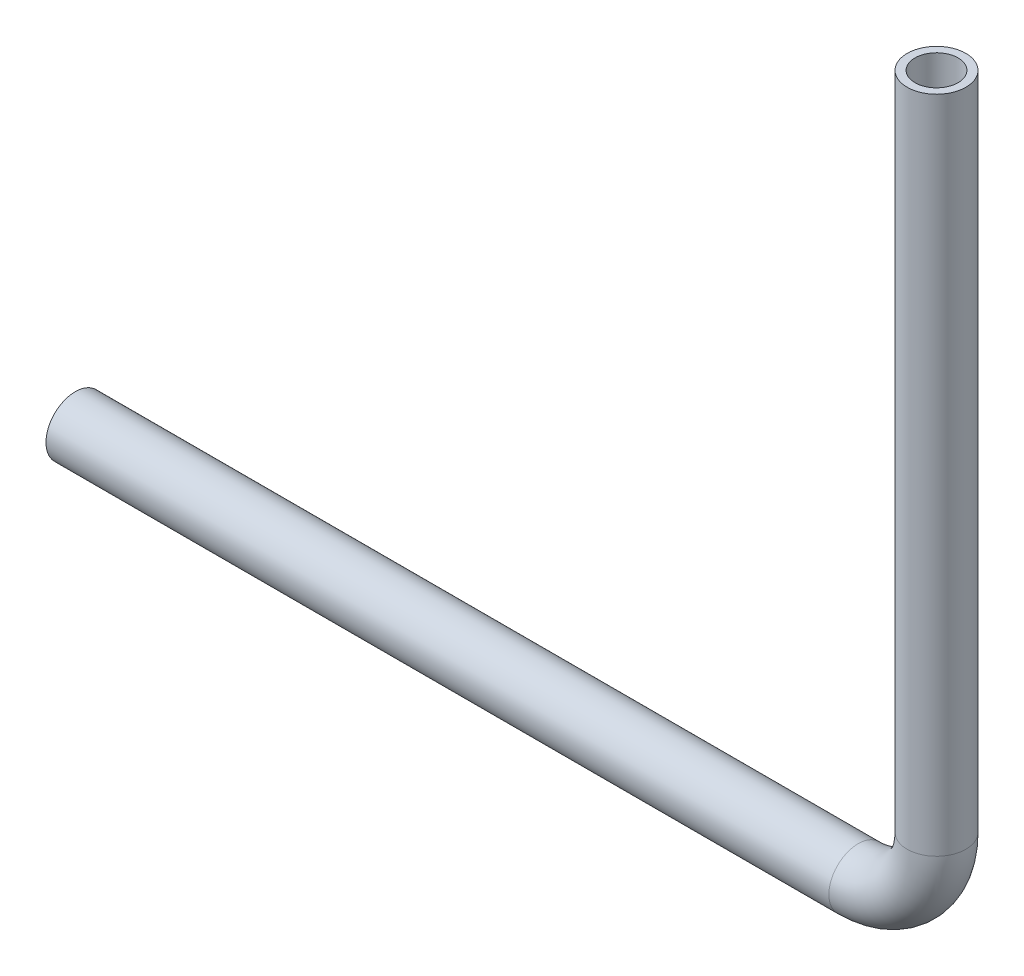
ISO-10303-21;
HEADER;
FILE_DESCRIPTION(('STEP AP214'),'2;1');
FILE_NAME('part.step','',(''),(''),'','','');
FILE_SCHEMA(('AUTOMOTIVE_DESIGN { 1 0 10303 214 1 1 1 1 }'));
ENDSEC;
DATA;
#1=APPLICATION_CONTEXT('core data for automotive mechanical design processes');
#2=APPLICATION_PROTOCOL_DEFINITION('international standard','automotive_design',2000,#1);
#3=PRODUCT_CONTEXT('',#1,'mechanical');
#4=PRODUCT('Part','Part','',(#3));
#5=PRODUCT_RELATED_PRODUCT_CATEGORY('part','',(#4));
#6=PRODUCT_DEFINITION_FORMATION('','',#4);
#7=PRODUCT_DEFINITION_CONTEXT('part definition',#1,'design');
#8=PRODUCT_DEFINITION('design','',#6,#7);
#9=PRODUCT_DEFINITION_SHAPE('','',#8);
#10=(LENGTH_UNIT() NAMED_UNIT(*) SI_UNIT(.MILLI.,.METRE.));
#11=(NAMED_UNIT(*) PLANE_ANGLE_UNIT() SI_UNIT($,.RADIAN.));
#12=(NAMED_UNIT(*) SI_UNIT($,.STERADIAN.) SOLID_ANGLE_UNIT());
#13=UNCERTAINTY_MEASURE_WITH_UNIT(LENGTH_MEASURE(1.E-05),#10,'distance_accuracy_value','');
#14=(GEOMETRIC_REPRESENTATION_CONTEXT(3) GLOBAL_UNCERTAINTY_ASSIGNED_CONTEXT((#13)) GLOBAL_UNIT_ASSIGNED_CONTEXT((#10,
#11,#12)) REPRESENTATION_CONTEXT('',''));
#15=CARTESIAN_POINT('',(0.,0.,0.));
#16=DIRECTION('',(0.,0.,1.));
#17=DIRECTION('',(1.,0.,0.));
#18=AXIS2_PLACEMENT_3D('',#15,#16,#17);
#19=CARTESIAN_POINT('',(-136.72178674794,77.0528753875564,0.));
#20=DIRECTION('',(1.,0.,0.));
#21=DIRECTION('',(0.,1.,0.));
#22=AXIS2_PLACEMENT_3D('',#19,#20,#21);
#23=CYLINDRICAL_SURFACE('',#22,7.5);
#24=CARTESIAN_POINT('',(63.2782132520605,77.0528753875564,0.));
#25=DIRECTION('',(1.,0.,0.));
#26=DIRECTION('',(0.,0.,-1.));
#27=AXIS2_PLACEMENT_3D('',#24,#25,#26);
#28=CIRCLE('',#27,7.5);
#29=CARTESIAN_POINT('',(63.2782132520604,69.5528753875557,0.));
#30=VERTEX_POINT('',#29);
#31=EDGE_CURVE('E54',#30,#30,#28,.T.);
#32=ORIENTED_EDGE('',*,*,#31,.F.);
#33=EDGE_LOOP('',(#32));
#34=FACE_BOUND('',#33,.T.);
#35=CARTESIAN_POINT('',(-136.72178674794,77.0528753875564,0.));
#36=DIRECTION('',(1.,0.,0.));
#37=DIRECTION('',(0.,0.,-1.));
#38=AXIS2_PLACEMENT_3D('',#35,#36,#37);
#39=CIRCLE('',#38,7.5);
#40=CARTESIAN_POINT('',(-136.72178674794,77.0528753875564,-7.5));
#41=VERTEX_POINT('',#40);
#42=EDGE_CURVE('E52',#41,#41,#39,.T.);
#43=ORIENTED_EDGE('',*,*,#42,.T.);
#44=EDGE_LOOP('',(#43));
#45=FACE_BOUND('',#44,.T.);
#46=ADVANCED_FACE('F31',(#34,#45),#23,.T.);
#47=CARTESIAN_POINT('',(63.2782132520606,97.0528753875565,0.));
#48=DIRECTION('',(0.,0.,1.));
#49=DIRECTION('',(1.,0.,0.));
#50=AXIS2_PLACEMENT_3D('',#47,#48,#49);
#51=TOROIDAL_SURFACE('',#50,20.0000000000008,7.5);
#52=CARTESIAN_POINT('',(83.2782132520606,97.0528753875565,0.));
#53=DIRECTION('',(0.,1.,0.));
#54=DIRECTION('',(0.,0.,-1.));
#55=AXIS2_PLACEMENT_3D('',#52,#53,#54);
#56=CIRCLE('',#55,7.5);
#57=CARTESIAN_POINT('',(90.7782132520614,97.0528753875565,0.));
#58=VERTEX_POINT('',#57);
#59=EDGE_CURVE('E35',#58,#58,#56,.T.);
#60=CARTESIAN_POINT('',(63.2782132520606,97.0528753875565,0.));
#61=DIRECTION('',(0.,0.,1.));
#62=DIRECTION('',(1.,0.,0.));
#63=AXIS2_PLACEMENT_3D('',#60,#61,#62);
#64=CIRCLE('',#63,27.5000000000008);
#65=EDGE_CURVE('',#30,#58,#64,.T.);
#66=ORIENTED_EDGE('',*,*,#31,.T.);
#67=ORIENTED_EDGE('',*,*,#59,.F.);
#68=ORIENTED_EDGE('',*,*,#65,.T.);
#69=ORIENTED_EDGE('',*,*,#65,.F.);
#70=EDGE_LOOP('',(#66,#68,#67,#69));
#71=FACE_BOUND('',#70,.T.);
#72=ADVANCED_FACE('F62',(#71),#51,.T.);
#73=CARTESIAN_POINT('',(83.2782132520604,97.0528753875565,0.));
#74=DIRECTION('',(0.,1.,0.));
#75=DIRECTION('',(-1.,0.,0.));
#76=AXIS2_PLACEMENT_3D('',#73,#74,#75);
#77=CYLINDRICAL_SURFACE('',#76,7.5);
#78=CARTESIAN_POINT('',(83.2782132520598,265.636948851659,0.));
#79=DIRECTION('',(0.,1.,0.));
#80=DIRECTION('',(0.,0.,-1.));
#81=AXIS2_PLACEMENT_3D('',#78,#79,#80);
#82=CIRCLE('',#81,7.5);
#83=CARTESIAN_POINT('',(83.2782132520598,265.636948851659,-7.5));
#84=VERTEX_POINT('',#83);
#85=EDGE_CURVE('E48',#84,#84,#82,.T.);
#86=ORIENTED_EDGE('',*,*,#85,.F.);
#87=EDGE_LOOP('',(#86));
#88=FACE_BOUND('',#87,.T.);
#89=ORIENTED_EDGE('',*,*,#59,.T.);
#90=EDGE_LOOP('',(#89));
#91=FACE_BOUND('',#90,.T.);
#92=ADVANCED_FACE('F33',(#88,#91),#77,.T.);
#93=CARTESIAN_POINT('',(-136.72178674794,77.0528753875564,0.));
#94=DIRECTION('',(1.,0.,0.));
#95=DIRECTION('',(0.,0.,-1.));
#96=AXIS2_PLACEMENT_3D('',#93,#94,#95);
#97=PLANE('',#96);
#98=CARTESIAN_POINT('',(-136.72178674794,77.0528753875564,0.));
#99=DIRECTION('',(1.,0.,0.));
#100=DIRECTION('',(0.,0.,-1.));
#101=AXIS2_PLACEMENT_3D('',#98,#99,#100);
#102=CIRCLE('',#101,5.5);
#103=CARTESIAN_POINT('',(-136.72178674794,77.0528753875564,-5.5));
#104=VERTEX_POINT('',#103);
#105=EDGE_CURVE('E51',#104,#104,#102,.F.);
#106=ORIENTED_EDGE('',*,*,#105,.F.);
#107=EDGE_LOOP('',(#106));
#108=FACE_BOUND('',#107,.T.);
#109=ORIENTED_EDGE('',*,*,#42,.F.);
#110=EDGE_LOOP('',(#109));
#111=FACE_BOUND('',#110,.T.);
#112=ADVANCED_FACE('F68',(#108,#111),#97,.F.);
#113=CARTESIAN_POINT('',(83.2782132520598,265.636948851659,0.));
#114=DIRECTION('',(0.,1.,0.));
#115=DIRECTION('',(0.,0.,-1.));
#116=AXIS2_PLACEMENT_3D('',#113,#114,#115);
#117=PLANE('',#116);
#118=CARTESIAN_POINT('',(83.2782132520598,265.636948851659,0.));
#119=DIRECTION('',(0.,1.,0.));
#120=DIRECTION('',(0.,0.,-1.));
#121=AXIS2_PLACEMENT_3D('',#118,#119,#120);
#122=CIRCLE('',#121,5.5);
#123=CARTESIAN_POINT('',(83.2782132520598,265.636948851659,-5.5));
#124=VERTEX_POINT('',#123);
#125=EDGE_CURVE('E10',#124,#124,#122,.F.);
#126=ORIENTED_EDGE('',*,*,#125,.T.);
#127=EDGE_LOOP('',(#126));
#128=FACE_BOUND('',#127,.T.);
#129=ORIENTED_EDGE('',*,*,#85,.T.);
#130=EDGE_LOOP('',(#129));
#131=FACE_BOUND('',#130,.T.);
#132=ADVANCED_FACE('F86',(#128,#131),#117,.T.);
#133=CARTESIAN_POINT('',(-136.72178674794,77.0528753875564,0.));
#134=DIRECTION('',(1.,0.,0.));
#135=DIRECTION('',(0.,1.,0.));
#136=AXIS2_PLACEMENT_3D('',#133,#134,#135);
#137=CYLINDRICAL_SURFACE('',#136,5.5);
#138=CARTESIAN_POINT('',(63.2782132520605,77.0528753875564,0.));
#139=DIRECTION('',(1.,0.,0.));
#140=DIRECTION('',(0.,0.,-1.));
#141=AXIS2_PLACEMENT_3D('',#138,#139,#140);
#142=CIRCLE('',#141,5.5);
#143=CARTESIAN_POINT('',(63.2782132520604,71.5528753875557,0.));
#144=VERTEX_POINT('',#143);
#145=EDGE_CURVE('E44',#144,#144,#142,.F.);
#146=ORIENTED_EDGE('',*,*,#145,.F.);
#147=EDGE_LOOP('',(#146));
#148=FACE_BOUND('',#147,.T.);
#149=ORIENTED_EDGE('',*,*,#105,.T.);
#150=EDGE_LOOP('',(#149));
#151=FACE_BOUND('',#150,.T.);
#152=ADVANCED_FACE('F80',(#148,#151),#137,.F.);
#153=CARTESIAN_POINT('',(63.2782132520606,97.0528753875565,0.));
#154=DIRECTION('',(0.,0.,1.));
#155=DIRECTION('',(1.,0.,0.));
#156=AXIS2_PLACEMENT_3D('',#153,#154,#155);
#157=TOROIDAL_SURFACE('',#156,20.0000000000008,5.5);
#158=CARTESIAN_POINT('',(83.2782132520606,97.0528753875565,0.));
#159=DIRECTION('',(0.,1.,0.));
#160=DIRECTION('',(0.,0.,-1.));
#161=AXIS2_PLACEMENT_3D('',#158,#159,#160);
#162=CIRCLE('',#161,5.5);
#163=CARTESIAN_POINT('',(88.7782132520614,97.0528753875565,0.));
#164=VERTEX_POINT('',#163);
#165=EDGE_CURVE('E39',#164,#164,#162,.F.);
#166=CARTESIAN_POINT('',(63.2782132520606,97.0528753875565,0.));
#167=DIRECTION('',(0.,0.,1.));
#168=DIRECTION('',(1.,0.,0.));
#169=AXIS2_PLACEMENT_3D('',#166,#167,#168);
#170=CIRCLE('',#169,25.5000000000008);
#171=EDGE_CURVE('',#144,#164,#170,.T.);
#172=ORIENTED_EDGE('',*,*,#145,.T.);
#173=ORIENTED_EDGE('',*,*,#165,.F.);
#174=ORIENTED_EDGE('',*,*,#171,.T.);
#175=ORIENTED_EDGE('',*,*,#171,.F.);
#176=EDGE_LOOP('',(#172,#174,#173,#175));
#177=FACE_BOUND('',#176,.T.);
#178=ADVANCED_FACE('F74',(#177),#157,.F.);
#179=CARTESIAN_POINT('',(83.2782132520604,97.0528753875565,0.));
#180=DIRECTION('',(0.,1.,0.));
#181=DIRECTION('',(-1.,0.,0.));
#182=AXIS2_PLACEMENT_3D('',#179,#180,#181);
#183=CYLINDRICAL_SURFACE('',#182,5.5);
#184=ORIENTED_EDGE('',*,*,#125,.F.);
#185=EDGE_LOOP('',(#184));
#186=FACE_BOUND('',#185,.T.);
#187=ORIENTED_EDGE('',*,*,#165,.T.);
#188=EDGE_LOOP('',(#187));
#189=FACE_BOUND('',#188,.T.);
#190=ADVANCED_FACE('F72',(#186,#189),#183,.F.);
#191=CLOSED_SHELL('',(#46,#72,#92,#112,#132,#152,#178,#190));
#192=MANIFOLD_SOLID_BREP('B2',#191);
#193=ADVANCED_BREP_SHAPE_REPRESENTATION('',(#18,#192),#14);
#194=SHAPE_DEFINITION_REPRESENTATION(#9,#193);
ENDSEC;
END-ISO-10303-21;
